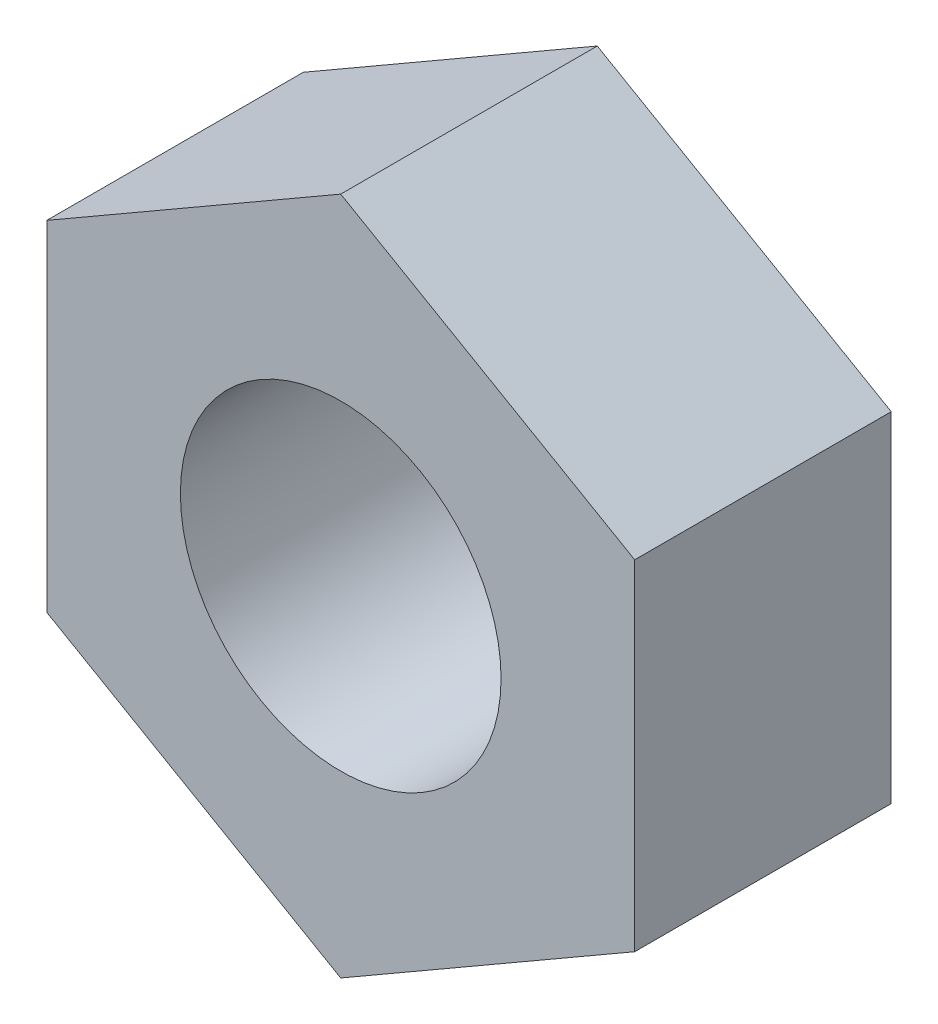
ISO-10303-21;
HEADER;
FILE_DESCRIPTION(('STEP AP214'),'2;1');
FILE_NAME('part.step','',(''),(''),'','','');
FILE_SCHEMA(('AUTOMOTIVE_DESIGN { 1 0 10303 214 1 1 1 1 }'));
ENDSEC;
DATA;
#1=APPLICATION_CONTEXT('core data for automotive mechanical design processes');
#2=APPLICATION_PROTOCOL_DEFINITION('international standard','automotive_design',2000,#1);
#3=PRODUCT_CONTEXT('',#1,'mechanical');
#4=PRODUCT('Part','Part','',(#3));
#5=PRODUCT_RELATED_PRODUCT_CATEGORY('part','',(#4));
#6=PRODUCT_DEFINITION_FORMATION('','',#4);
#7=PRODUCT_DEFINITION_CONTEXT('part definition',#1,'design');
#8=PRODUCT_DEFINITION('design','',#6,#7);
#9=PRODUCT_DEFINITION_SHAPE('','',#8);
#10=(LENGTH_UNIT() NAMED_UNIT(*) SI_UNIT(.MILLI.,.METRE.));
#11=(NAMED_UNIT(*) PLANE_ANGLE_UNIT() SI_UNIT($,.RADIAN.));
#12=(NAMED_UNIT(*) SI_UNIT($,.STERADIAN.) SOLID_ANGLE_UNIT());
#13=UNCERTAINTY_MEASURE_WITH_UNIT(LENGTH_MEASURE(1.E-05),#10,'distance_accuracy_value','');
#14=(GEOMETRIC_REPRESENTATION_CONTEXT(3) GLOBAL_UNCERTAINTY_ASSIGNED_CONTEXT((#13)) GLOBAL_UNIT_ASSIGNED_CONTEXT((#10,
#11,#12)) REPRESENTATION_CONTEXT('',''));
#15=CARTESIAN_POINT('',(0.,0.,0.));
#16=DIRECTION('',(0.,0.,1.));
#17=DIRECTION('',(1.,0.,0.));
#18=AXIS2_PLACEMENT_3D('',#15,#16,#17);
#19=CARTESIAN_POINT('',(0.,0.,2.4));
#20=DIRECTION('',(0.,0.,1.));
#21=DIRECTION('',(1.,0.,0.));
#22=AXIS2_PLACEMENT_3D('',#19,#20,#21);
#23=PLANE('',#22);
#24=DIRECTION('',(0.,-1.,0.));
#25=VECTOR('',#24,1.);
#26=CARTESIAN_POINT('',(-2.75,1.58771324027147,2.4));
#27=LINE('',#26,#25);
#28=CARTESIAN_POINT('',(-2.75,1.58771324027147,2.4));
#29=VERTEX_POINT('',#28);
#30=CARTESIAN_POINT('',(-2.75,-1.58771324027147,2.4));
#31=VERTEX_POINT('',#30);
#32=EDGE_CURVE('E154',#29,#31,#27,.T.);
#33=ORIENTED_EDGE('',*,*,#32,.T.);
#34=DIRECTION('',(0.866025403784439,-0.5,0.));
#35=VECTOR('',#34,1.);
#36=CARTESIAN_POINT('',(-2.75,-1.58771324027147,2.4));
#37=LINE('',#36,#35);
#38=CARTESIAN_POINT('',(0.,-3.17542648054294,2.4));
#39=VERTEX_POINT('',#38);
#40=EDGE_CURVE('E112',#31,#39,#37,.T.);
#41=ORIENTED_EDGE('',*,*,#40,.T.);
#42=DIRECTION('',(0.866025403784439,0.5,0.));
#43=VECTOR('',#42,1.);
#44=CARTESIAN_POINT('',(0.,-3.17542648054294,2.4));
#45=LINE('',#44,#43);
#46=CARTESIAN_POINT('',(2.75,-1.58771324027147,2.4));
#47=VERTEX_POINT('',#46);
#48=EDGE_CURVE('E125',#39,#47,#45,.T.);
#49=ORIENTED_EDGE('',*,*,#48,.T.);
#50=DIRECTION('',(0.,1.,0.));
#51=VECTOR('',#50,1.);
#52=CARTESIAN_POINT('',(2.75,-1.58771324027147,2.4));
#53=LINE('',#52,#51);
#54=CARTESIAN_POINT('',(2.75,1.58771324027147,2.4));
#55=VERTEX_POINT('',#54);
#56=EDGE_CURVE('E119',#47,#55,#53,.T.);
#57=ORIENTED_EDGE('',*,*,#56,.T.);
#58=DIRECTION('',(-0.866025403784439,0.5,0.));
#59=VECTOR('',#58,1.);
#60=CARTESIAN_POINT('',(2.75,1.58771324027147,2.4));
#61=LINE('',#60,#59);
#62=CARTESIAN_POINT('',(0.,3.17542648054294,2.4));
#63=VERTEX_POINT('',#62);
#64=EDGE_CURVE('E123',#55,#63,#61,.T.);
#65=ORIENTED_EDGE('',*,*,#64,.T.);
#66=DIRECTION('',(-0.866025403784439,-0.5,0.));
#67=VECTOR('',#66,1.);
#68=CARTESIAN_POINT('',(0.,3.17542648054294,2.4));
#69=LINE('',#68,#67);
#70=EDGE_CURVE('E75',#63,#29,#69,.T.);
#71=ORIENTED_EDGE('',*,*,#70,.T.);
#72=EDGE_LOOP('',(#33,#41,#49,#57,#65,#71));
#73=FACE_BOUND('',#72,.T.);
#74=CARTESIAN_POINT('',(0.,0.,2.4));
#75=DIRECTION('',(0.,0.,1.));
#76=DIRECTION('',(1.,0.,0.));
#77=AXIS2_PLACEMENT_3D('',#74,#75,#76);
#78=CIRCLE('',#77,1.5);
#79=CARTESIAN_POINT('',(1.5,0.,2.4));
#80=VERTEX_POINT('',#79);
#81=EDGE_CURVE('E147',#80,#80,#78,.T.);
#82=ORIENTED_EDGE('',*,*,#81,.F.);
#83=EDGE_LOOP('',(#82));
#84=FACE_BOUND('',#83,.T.);
#85=ADVANCED_FACE('F58',(#73,#84),#23,.T.);
#86=CARTESIAN_POINT('',(0.,0.,0.));
#87=DIRECTION('',(0.,0.,1.));
#88=DIRECTION('',(1.,0.,0.));
#89=AXIS2_PLACEMENT_3D('',#86,#87,#88);
#90=PLANE('',#89);
#91=DIRECTION('',(0.,-1.,0.));
#92=VECTOR('',#91,1.);
#93=CARTESIAN_POINT('',(-2.75,1.58771324027147,0.));
#94=LINE('',#93,#92);
#95=CARTESIAN_POINT('',(-2.75,1.58771324027147,0.));
#96=VERTEX_POINT('',#95);
#97=CARTESIAN_POINT('',(-2.75,-1.58771324027147,0.));
#98=VERTEX_POINT('',#97);
#99=EDGE_CURVE('E143',#96,#98,#94,.T.);
#100=ORIENTED_EDGE('',*,*,#99,.F.);
#101=DIRECTION('',(-0.866025403784439,-0.5,0.));
#102=VECTOR('',#101,1.);
#103=CARTESIAN_POINT('',(0.,3.17542648054294,0.));
#104=LINE('',#103,#102);
#105=CARTESIAN_POINT('',(0.,3.17542648054294,0.));
#106=VERTEX_POINT('',#105);
#107=EDGE_CURVE('E104',#106,#96,#104,.T.);
#108=ORIENTED_EDGE('',*,*,#107,.F.);
#109=DIRECTION('',(-0.866025403784439,0.5,0.));
#110=VECTOR('',#109,1.);
#111=CARTESIAN_POINT('',(2.75,1.58771324027147,0.));
#112=LINE('',#111,#110);
#113=CARTESIAN_POINT('',(2.75,1.58771324027147,0.));
#114=VERTEX_POINT('',#113);
#115=EDGE_CURVE('E98',#114,#106,#112,.T.);
#116=ORIENTED_EDGE('',*,*,#115,.F.);
#117=DIRECTION('',(0.,1.,0.));
#118=VECTOR('',#117,1.);
#119=CARTESIAN_POINT('',(2.75,-1.58771324027147,0.));
#120=LINE('',#119,#118);
#121=CARTESIAN_POINT('',(2.75,-1.58771324027147,0.));
#122=VERTEX_POINT('',#121);
#123=EDGE_CURVE('E133',#122,#114,#120,.T.);
#124=ORIENTED_EDGE('',*,*,#123,.F.);
#125=DIRECTION('',(0.866025403784439,0.5,0.));
#126=VECTOR('',#125,1.);
#127=CARTESIAN_POINT('',(0.,-3.17542648054294,0.));
#128=LINE('',#127,#126);
#129=CARTESIAN_POINT('',(0.,-3.17542648054294,0.));
#130=VERTEX_POINT('',#129);
#131=EDGE_CURVE('E149',#130,#122,#128,.T.);
#132=ORIENTED_EDGE('',*,*,#131,.F.);
#133=DIRECTION('',(0.866025403784439,-0.5,0.));
#134=VECTOR('',#133,1.);
#135=CARTESIAN_POINT('',(-2.75,-1.58771324027147,0.));
#136=LINE('',#135,#134);
#137=EDGE_CURVE('E146',#98,#130,#136,.T.);
#138=ORIENTED_EDGE('',*,*,#137,.F.);
#139=EDGE_LOOP('',(#100,#108,#116,#124,#132,#138));
#140=FACE_BOUND('',#139,.T.);
#141=CARTESIAN_POINT('',(0.,0.,0.));
#142=DIRECTION('',(0.,0.,1.));
#143=DIRECTION('',(1.,0.,0.));
#144=AXIS2_PLACEMENT_3D('',#141,#142,#143);
#145=CIRCLE('',#144,1.5);
#146=CARTESIAN_POINT('',(1.5,0.,0.));
#147=VERTEX_POINT('',#146);
#148=EDGE_CURVE('E247',#147,#147,#145,.T.);
#149=ORIENTED_EDGE('',*,*,#148,.T.);
#150=EDGE_LOOP('',(#149));
#151=FACE_BOUND('',#150,.T.);
#152=ADVANCED_FACE('F163',(#140,#151),#90,.F.);
#153=CARTESIAN_POINT('',(-2.75,1.58771324027147,2.4));
#154=DIRECTION('',(1.,0.,0.));
#155=DIRECTION('',(0.,1.,0.));
#156=AXIS2_PLACEMENT_3D('',#153,#154,#155);
#157=PLANE('',#156);
#158=ORIENTED_EDGE('',*,*,#99,.T.);
#159=DIRECTION('',(0.,0.,-1.));
#160=VECTOR('',#159,1.);
#161=CARTESIAN_POINT('',(-2.75,-1.58771324027147,2.4));
#162=LINE('',#161,#160);
#163=EDGE_CURVE('E12',#31,#98,#162,.T.);
#164=ORIENTED_EDGE('',*,*,#163,.F.);
#165=ORIENTED_EDGE('',*,*,#32,.F.);
#166=DIRECTION('',(0.,0.,-1.));
#167=VECTOR('',#166,1.);
#168=CARTESIAN_POINT('',(-2.75,1.58771324027147,2.4));
#169=LINE('',#168,#167);
#170=EDGE_CURVE('E139',#29,#96,#169,.T.);
#171=ORIENTED_EDGE('',*,*,#170,.T.);
#172=EDGE_LOOP('',(#158,#164,#165,#171));
#173=FACE_BOUND('',#172,.T.);
#174=ADVANCED_FACE('F60',(#173),#157,.F.);
#175=CARTESIAN_POINT('',(-2.75,-1.58771324027147,2.4));
#176=DIRECTION('',(0.5,0.866025403784439,0.));
#177=DIRECTION('',(-0.866025403784439,0.5,0.));
#178=AXIS2_PLACEMENT_3D('',#175,#176,#177);
#179=PLANE('',#178);
#180=ORIENTED_EDGE('',*,*,#137,.T.);
#181=DIRECTION('',(0.,0.,-1.));
#182=VECTOR('',#181,1.);
#183=CARTESIAN_POINT('',(0.,-3.17542648054294,2.4));
#184=LINE('',#183,#182);
#185=EDGE_CURVE('E67',#39,#130,#184,.T.);
#186=ORIENTED_EDGE('',*,*,#185,.F.);
#187=ORIENTED_EDGE('',*,*,#40,.F.);
#188=ORIENTED_EDGE('',*,*,#163,.T.);
#189=EDGE_LOOP('',(#180,#186,#187,#188));
#190=FACE_BOUND('',#189,.T.);
#191=ADVANCED_FACE('F188',(#190),#179,.F.);
#192=CARTESIAN_POINT('',(0.,-3.17542648054294,2.4));
#193=DIRECTION('',(-0.5,0.866025403784439,0.));
#194=DIRECTION('',(-0.866025403784439,-0.5,0.));
#195=AXIS2_PLACEMENT_3D('',#192,#193,#194);
#196=PLANE('',#195);
#197=ORIENTED_EDGE('',*,*,#131,.T.);
#198=DIRECTION('',(0.,0.,-1.));
#199=VECTOR('',#198,1.);
#200=CARTESIAN_POINT('',(2.75,-1.58771324027147,2.4));
#201=LINE('',#200,#199);
#202=EDGE_CURVE('E134',#47,#122,#201,.T.);
#203=ORIENTED_EDGE('',*,*,#202,.F.);
#204=ORIENTED_EDGE('',*,*,#48,.F.);
#205=ORIENTED_EDGE('',*,*,#185,.T.);
#206=EDGE_LOOP('',(#197,#203,#204,#205));
#207=FACE_BOUND('',#206,.T.);
#208=ADVANCED_FACE('F160',(#207),#196,.F.);
#209=CARTESIAN_POINT('',(2.75,-1.58771324027147,2.4));
#210=DIRECTION('',(-1.,0.,0.));
#211=DIRECTION('',(0.,-1.,0.));
#212=AXIS2_PLACEMENT_3D('',#209,#210,#211);
#213=PLANE('',#212);
#214=ORIENTED_EDGE('',*,*,#123,.T.);
#215=DIRECTION('',(0.,0.,-1.));
#216=VECTOR('',#215,1.);
#217=CARTESIAN_POINT('',(2.75,1.58771324027147,2.4));
#218=LINE('',#217,#216);
#219=EDGE_CURVE('E130',#55,#114,#218,.T.);
#220=ORIENTED_EDGE('',*,*,#219,.F.);
#221=ORIENTED_EDGE('',*,*,#56,.F.);
#222=ORIENTED_EDGE('',*,*,#202,.T.);
#223=EDGE_LOOP('',(#214,#220,#221,#222));
#224=FACE_BOUND('',#223,.T.);
#225=ADVANCED_FACE('F131',(#224),#213,.F.);
#226=CARTESIAN_POINT('',(2.75,1.58771324027147,2.4));
#227=DIRECTION('',(-0.5,-0.866025403784439,0.));
#228=DIRECTION('',(0.866025403784439,-0.5,0.));
#229=AXIS2_PLACEMENT_3D('',#226,#227,#228);
#230=PLANE('',#229);
#231=ORIENTED_EDGE('',*,*,#115,.T.);
#232=DIRECTION('',(0.,0.,-1.));
#233=VECTOR('',#232,1.);
#234=CARTESIAN_POINT('',(0.,3.17542648054294,2.4));
#235=LINE('',#234,#233);
#236=EDGE_CURVE('E135',#63,#106,#235,.T.);
#237=ORIENTED_EDGE('',*,*,#236,.F.);
#238=ORIENTED_EDGE('',*,*,#64,.F.);
#239=ORIENTED_EDGE('',*,*,#219,.T.);
#240=EDGE_LOOP('',(#231,#237,#238,#239));
#241=FACE_BOUND('',#240,.T.);
#242=ADVANCED_FACE('F137',(#241),#230,.F.);
#243=CARTESIAN_POINT('',(0.,3.17542648054294,2.4));
#244=DIRECTION('',(0.5,-0.866025403784439,0.));
#245=DIRECTION('',(0.866025403784439,0.5,0.));
#246=AXIS2_PLACEMENT_3D('',#243,#244,#245);
#247=PLANE('',#246);
#248=ORIENTED_EDGE('',*,*,#107,.T.);
#249=ORIENTED_EDGE('',*,*,#170,.F.);
#250=ORIENTED_EDGE('',*,*,#70,.F.);
#251=ORIENTED_EDGE('',*,*,#236,.T.);
#252=EDGE_LOOP('',(#248,#249,#250,#251));
#253=FACE_BOUND('',#252,.T.);
#254=ADVANCED_FACE('F168',(#253),#247,.F.);
#255=CARTESIAN_POINT('',(0.,0.,2.4));
#256=DIRECTION('',(0.,0.,-1.));
#257=DIRECTION('',(-1.,0.,0.));
#258=AXIS2_PLACEMENT_3D('',#255,#256,#257);
#259=CYLINDRICAL_SURFACE('',#258,1.5);
#260=ORIENTED_EDGE('',*,*,#81,.T.);
#261=EDGE_LOOP('',(#260));
#262=FACE_BOUND('',#261,.T.);
#263=ORIENTED_EDGE('',*,*,#148,.F.);
#264=EDGE_LOOP('',(#263));
#265=FACE_BOUND('',#264,.T.);
#266=ADVANCED_FACE('F170',(#262,#265),#259,.F.);
#267=CLOSED_SHELL('',(#85,#152,#174,#191,#208,#225,#242,#254,#266));
#268=MANIFOLD_SOLID_BREP('B2',#267);
#269=ADVANCED_BREP_SHAPE_REPRESENTATION('',(#18,#268),#14);
#270=SHAPE_DEFINITION_REPRESENTATION(#9,#269);
ENDSEC;
END-ISO-10303-21;
